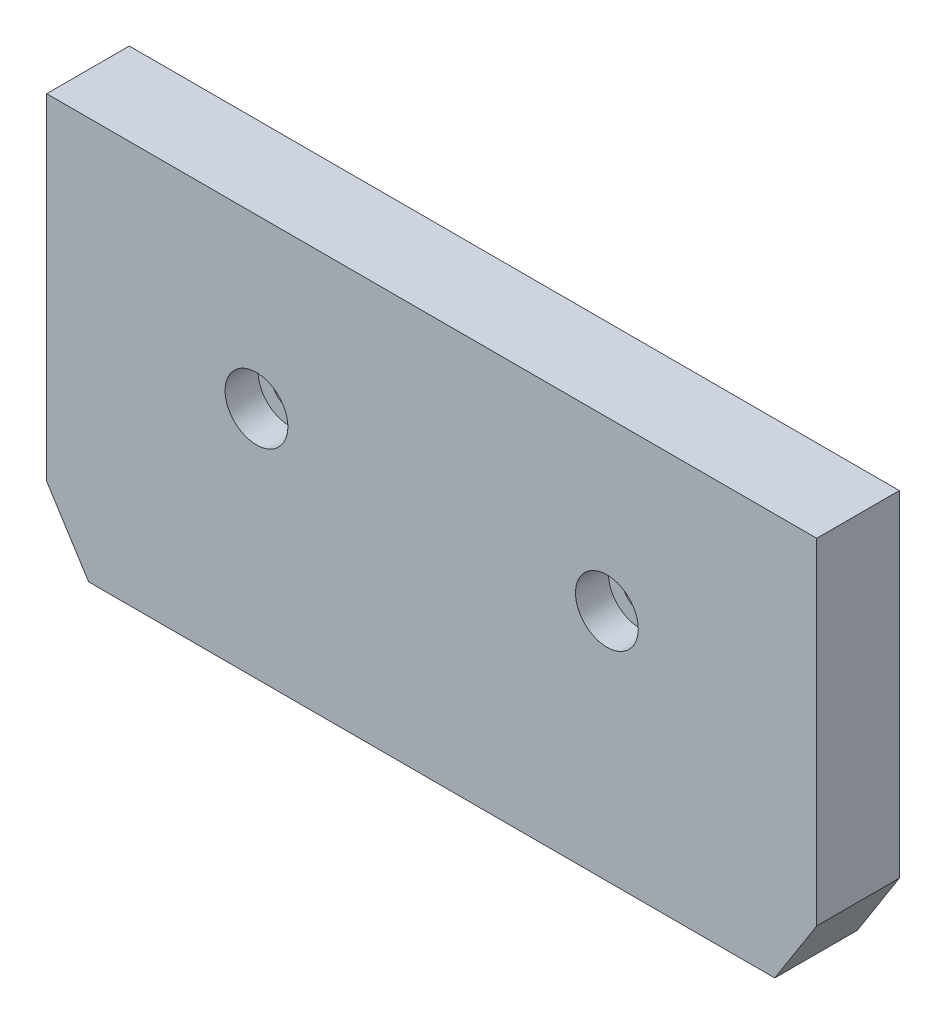
ISO-10303-21;
HEADER;
FILE_DESCRIPTION(('STEP AP214'),'2;1');
FILE_NAME('part.step','',(''),(''),'','','');
FILE_SCHEMA(('AUTOMOTIVE_DESIGN { 1 0 10303 214 1 1 1 1 }'));
ENDSEC;
DATA;
#1=APPLICATION_CONTEXT('core data for automotive mechanical design processes');
#2=APPLICATION_PROTOCOL_DEFINITION('international standard','automotive_design',2000,#1);
#3=PRODUCT_CONTEXT('',#1,'mechanical');
#4=PRODUCT('Part','Part','',(#3));
#5=PRODUCT_RELATED_PRODUCT_CATEGORY('part','',(#4));
#6=PRODUCT_DEFINITION_FORMATION('','',#4);
#7=PRODUCT_DEFINITION_CONTEXT('part definition',#1,'design');
#8=PRODUCT_DEFINITION('design','',#6,#7);
#9=PRODUCT_DEFINITION_SHAPE('','',#8);
#10=(LENGTH_UNIT() NAMED_UNIT(*) SI_UNIT(.MILLI.,.METRE.));
#11=(NAMED_UNIT(*) PLANE_ANGLE_UNIT() SI_UNIT($,.RADIAN.));
#12=(NAMED_UNIT(*) SI_UNIT($,.STERADIAN.) SOLID_ANGLE_UNIT());
#13=UNCERTAINTY_MEASURE_WITH_UNIT(LENGTH_MEASURE(1.E-05),#10,'distance_accuracy_value','');
#14=(GEOMETRIC_REPRESENTATION_CONTEXT(3) GLOBAL_UNCERTAINTY_ASSIGNED_CONTEXT((#13)) GLOBAL_UNIT_ASSIGNED_CONTEXT((#10,
#11,#12)) REPRESENTATION_CONTEXT('',''));
#15=CARTESIAN_POINT('',(0.,0.,0.));
#16=DIRECTION('',(0.,0.,1.));
#17=DIRECTION('',(1.,0.,0.));
#18=AXIS2_PLACEMENT_3D('',#15,#16,#17);
#19=CARTESIAN_POINT('',(139.162889518911,-88.3684348445086,10.));
#20=DIRECTION('',(0.844182496695168,-0.536055885401432,0.));
#21=DIRECTION('',(0.536055885401432,0.844182496695168,0.));
#22=AXIS2_PLACEMENT_3D('',#19,#20,#21);
#23=PLANE('',#22);
#24=DIRECTION('',(-0.536055885401432,-0.844182496695168,0.));
#25=VECTOR('',#24,1.);
#26=CARTESIAN_POINT('',(139.162889518911,-88.3684348445086,0.));
#27=LINE('',#26,#25);
#28=CARTESIAN_POINT('',(186.44,-13.9162923546049,0.));
#29=VERTEX_POINT('',#28);
#30=CARTESIAN_POINT('',(181.36,-21.9162923546049,0.));
#31=VERTEX_POINT('',#30);
#32=EDGE_CURVE('E134',#29,#31,#27,.T.);
#33=ORIENTED_EDGE('',*,*,#32,.F.);
#34=DIRECTION('',(0.,0.,-1.));
#35=VECTOR('',#34,1.);
#36=CARTESIAN_POINT('',(186.44,-13.9162923546049,10.));
#37=LINE('',#36,#35);
#38=CARTESIAN_POINT('',(186.44,-13.9162923546049,10.));
#39=VERTEX_POINT('',#38);
#40=EDGE_CURVE('E11',#39,#29,#37,.T.);
#41=ORIENTED_EDGE('',*,*,#40,.F.);
#42=DIRECTION('',(-0.536055885401432,-0.844182496695168,0.));
#43=VECTOR('',#42,1.);
#44=CARTESIAN_POINT('',(139.162889518911,-88.3684348445086,10.));
#45=LINE('',#44,#43);
#46=CARTESIAN_POINT('',(181.36,-21.9162923546049,10.));
#47=VERTEX_POINT('',#46);
#48=EDGE_CURVE('E154',#39,#47,#45,.T.);
#49=ORIENTED_EDGE('',*,*,#48,.T.);
#50=DIRECTION('',(0.,0.,-1.));
#51=VECTOR('',#50,1.);
#52=CARTESIAN_POINT('',(181.36,-21.9162923546049,10.));
#53=LINE('',#52,#51);
#54=EDGE_CURVE('E95',#47,#31,#53,.T.);
#55=ORIENTED_EDGE('',*,*,#54,.T.);
#56=EDGE_LOOP('',(#33,#41,#49,#55));
#57=FACE_BOUND('',#56,.T.);
#58=ADVANCED_FACE('F47',(#57),#23,.T.);
#59=CARTESIAN_POINT('',(186.44,0.,10.));
#60=DIRECTION('',(1.,0.,0.));
#61=DIRECTION('',(0.,0.,-1.));
#62=AXIS2_PLACEMENT_3D('',#59,#60,#61);
#63=PLANE('',#62);
#64=DIRECTION('',(0.,-1.,0.));
#65=VECTOR('',#64,1.);
#66=CARTESIAN_POINT('',(186.44,0.,0.));
#67=LINE('',#66,#65);
#68=CARTESIAN_POINT('',(186.44,26.7237076453951,0.));
#69=VERTEX_POINT('',#68);
#70=EDGE_CURVE('E138',#69,#29,#67,.T.);
#71=ORIENTED_EDGE('',*,*,#70,.F.);
#72=DIRECTION('',(0.,0.,-1.));
#73=VECTOR('',#72,1.);
#74=CARTESIAN_POINT('',(186.44,26.7237076453951,10.));
#75=LINE('',#74,#73);
#76=CARTESIAN_POINT('',(186.44,26.7237076453951,10.));
#77=VERTEX_POINT('',#76);
#78=EDGE_CURVE('E57',#77,#69,#75,.T.);
#79=ORIENTED_EDGE('',*,*,#78,.F.);
#80=DIRECTION('',(0.,-1.,0.));
#81=VECTOR('',#80,1.);
#82=CARTESIAN_POINT('',(186.44,0.,10.));
#83=LINE('',#82,#81);
#84=EDGE_CURVE('E195',#77,#39,#83,.T.);
#85=ORIENTED_EDGE('',*,*,#84,.T.);
#86=ORIENTED_EDGE('',*,*,#40,.T.);
#87=EDGE_LOOP('',(#71,#79,#85,#86));
#88=FACE_BOUND('',#87,.T.);
#89=ADVANCED_FACE('F209',(#88),#63,.T.);
#90=CARTESIAN_POINT('',(0.,26.7237076453951,10.));
#91=DIRECTION('',(0.,1.,0.));
#92=DIRECTION('',(0.,0.,1.));
#93=AXIS2_PLACEMENT_3D('',#90,#91,#92);
#94=PLANE('',#93);
#95=DIRECTION('',(1.,0.,0.));
#96=VECTOR('',#95,1.);
#97=CARTESIAN_POINT('',(0.,26.7237076453951,0.));
#98=LINE('',#97,#96);
#99=CARTESIAN_POINT('',(93.22,26.7237076453951,0.));
#100=VERTEX_POINT('',#99);
#101=EDGE_CURVE('E143',#100,#69,#98,.T.);
#102=ORIENTED_EDGE('',*,*,#101,.F.);
#103=DIRECTION('',(0.,0.,-1.));
#104=VECTOR('',#103,1.);
#105=CARTESIAN_POINT('',(93.22,26.7237076453951,10.));
#106=LINE('',#105,#104);
#107=CARTESIAN_POINT('',(93.22,26.7237076453951,10.));
#108=VERTEX_POINT('',#107);
#109=EDGE_CURVE('E124',#108,#100,#106,.T.);
#110=ORIENTED_EDGE('',*,*,#109,.F.);
#111=DIRECTION('',(1.,0.,0.));
#112=VECTOR('',#111,1.);
#113=CARTESIAN_POINT('',(0.,26.7237076453951,10.));
#114=LINE('',#113,#112);
#115=EDGE_CURVE('E115',#108,#77,#114,.T.);
#116=ORIENTED_EDGE('',*,*,#115,.T.);
#117=ORIENTED_EDGE('',*,*,#78,.T.);
#118=EDGE_LOOP('',(#102,#110,#116,#117));
#119=FACE_BOUND('',#118,.T.);
#120=ADVANCED_FACE('F201',(#119),#94,.T.);
#121=CARTESIAN_POINT('',(93.22,0.,10.));
#122=DIRECTION('',(1.,0.,0.));
#123=DIRECTION('',(0.,0.,-1.));
#124=AXIS2_PLACEMENT_3D('',#121,#122,#123);
#125=PLANE('',#124);
#126=DIRECTION('',(0.,-1.,0.));
#127=VECTOR('',#126,1.);
#128=CARTESIAN_POINT('',(93.22,0.,0.));
#129=LINE('',#128,#127);
#130=CARTESIAN_POINT('',(93.22,-13.9162923546049,0.));
#131=VERTEX_POINT('',#130);
#132=EDGE_CURVE('E122',#100,#131,#129,.T.);
#133=ORIENTED_EDGE('',*,*,#132,.T.);
#134=DIRECTION('',(0.,0.,-1.));
#135=VECTOR('',#134,1.);
#136=CARTESIAN_POINT('',(93.22,-13.9162923546049,10.));
#137=LINE('',#136,#135);
#138=CARTESIAN_POINT('',(93.22,-13.9162923546049,10.));
#139=VERTEX_POINT('',#138);
#140=EDGE_CURVE('E119',#139,#131,#137,.T.);
#141=ORIENTED_EDGE('',*,*,#140,.F.);
#142=DIRECTION('',(0.,-1.,0.));
#143=VECTOR('',#142,1.);
#144=CARTESIAN_POINT('',(93.22,0.,10.));
#145=LINE('',#144,#143);
#146=EDGE_CURVE('E108',#108,#139,#145,.T.);
#147=ORIENTED_EDGE('',*,*,#146,.F.);
#148=ORIENTED_EDGE('',*,*,#109,.T.);
#149=EDGE_LOOP('',(#133,#141,#147,#148));
#150=FACE_BOUND('',#149,.T.);
#151=ADVANCED_FACE('F120',(#150),#125,.F.);
#152=CARTESIAN_POINT('',(60.1351560546782,38.1858240947207,10.));
#153=DIRECTION('',(0.844182496695168,0.536055885401432,0.));
#154=DIRECTION('',(-0.536055885401432,0.844182496695168,0.));
#155=AXIS2_PLACEMENT_3D('',#152,#153,#154);
#156=PLANE('',#155);
#157=DIRECTION('',(0.536055885401432,-0.844182496695168,0.));
#158=VECTOR('',#157,1.);
#159=CARTESIAN_POINT('',(60.1351560546782,38.1858240947207,0.));
#160=LINE('',#159,#158);
#161=CARTESIAN_POINT('',(98.3,-21.9162923546049,0.));
#162=VERTEX_POINT('',#161);
#163=EDGE_CURVE('E88',#131,#162,#160,.T.);
#164=ORIENTED_EDGE('',*,*,#163,.T.);
#165=DIRECTION('',(0.,0.,-1.));
#166=VECTOR('',#165,1.);
#167=CARTESIAN_POINT('',(98.3,-21.9162923546049,10.));
#168=LINE('',#167,#166);
#169=CARTESIAN_POINT('',(98.3,-21.9162923546049,10.));
#170=VERTEX_POINT('',#169);
#171=EDGE_CURVE('E125',#170,#162,#168,.T.);
#172=ORIENTED_EDGE('',*,*,#171,.F.);
#173=DIRECTION('',(0.536055885401432,-0.844182496695168,0.));
#174=VECTOR('',#173,1.);
#175=CARTESIAN_POINT('',(60.1351560546782,38.1858240947207,10.));
#176=LINE('',#175,#174);
#177=EDGE_CURVE('E112',#139,#170,#176,.T.);
#178=ORIENTED_EDGE('',*,*,#177,.F.);
#179=ORIENTED_EDGE('',*,*,#140,.T.);
#180=EDGE_LOOP('',(#164,#172,#178,#179));
#181=FACE_BOUND('',#180,.T.);
#182=ADVANCED_FACE('F127',(#181),#156,.F.);
#183=CARTESIAN_POINT('',(0.,-21.9162923546049,10.));
#184=DIRECTION('',(0.,1.,0.));
#185=DIRECTION('',(0.,0.,1.));
#186=AXIS2_PLACEMENT_3D('',#183,#184,#185);
#187=PLANE('',#186);
#188=DIRECTION('',(1.,0.,0.));
#189=VECTOR('',#188,1.);
#190=CARTESIAN_POINT('',(0.,-21.9162923546049,0.));
#191=LINE('',#190,#189);
#192=EDGE_CURVE('E151',#162,#31,#191,.T.);
#193=ORIENTED_EDGE('',*,*,#192,.T.);
#194=ORIENTED_EDGE('',*,*,#54,.F.);
#195=DIRECTION('',(1.,0.,0.));
#196=VECTOR('',#195,1.);
#197=CARTESIAN_POINT('',(0.,-21.9162923546049,10.));
#198=LINE('',#197,#196);
#199=EDGE_CURVE('E66',#170,#47,#198,.T.);
#200=ORIENTED_EDGE('',*,*,#199,.F.);
#201=ORIENTED_EDGE('',*,*,#171,.T.);
#202=EDGE_LOOP('',(#193,#194,#200,#201));
#203=FACE_BOUND('',#202,.T.);
#204=ADVANCED_FACE('F207',(#203),#187,.F.);
#205=CARTESIAN_POINT('',(0.,0.,10.));
#206=DIRECTION('',(0.,0.,1.));
#207=DIRECTION('',(1.,0.,0.));
#208=AXIS2_PLACEMENT_3D('',#205,#206,#207);
#209=PLANE('',#208);
#210=CARTESIAN_POINT('',(161.04,6.4037076453951,10.));
#211=DIRECTION('',(0.,0.,1.));
#212=DIRECTION('',(1.,0.,0.));
#213=AXIS2_PLACEMENT_3D('',#210,#211,#212);
#214=CIRCLE('',#213,3.8);
#215=CARTESIAN_POINT('',(164.84,6.4037076453951,10.));
#216=VERTEX_POINT('',#215);
#217=EDGE_CURVE('E186',#216,#216,#214,.T.);
#218=ORIENTED_EDGE('',*,*,#217,.F.);
#219=EDGE_LOOP('',(#218));
#220=FACE_BOUND('',#219,.T.);
#221=CARTESIAN_POINT('',(118.62,6.4037076453951,10.));
#222=DIRECTION('',(0.,0.,1.));
#223=DIRECTION('',(1.,0.,0.));
#224=AXIS2_PLACEMENT_3D('',#221,#222,#223);
#225=CIRCLE('',#224,3.8);
#226=CARTESIAN_POINT('',(122.42,6.4037076453951,10.));
#227=VERTEX_POINT('',#226);
#228=EDGE_CURVE('E172',#227,#227,#225,.T.);
#229=ORIENTED_EDGE('',*,*,#228,.F.);
#230=EDGE_LOOP('',(#229));
#231=FACE_BOUND('',#230,.T.);
#232=ORIENTED_EDGE('',*,*,#48,.F.);
#233=ORIENTED_EDGE('',*,*,#84,.F.);
#234=ORIENTED_EDGE('',*,*,#115,.F.);
#235=ORIENTED_EDGE('',*,*,#146,.T.);
#236=ORIENTED_EDGE('',*,*,#177,.T.);
#237=ORIENTED_EDGE('',*,*,#199,.T.);
#238=EDGE_LOOP('',(#232,#233,#234,#235,#236,#237));
#239=FACE_BOUND('',#238,.T.);
#240=ADVANCED_FACE('F110',(#220,#231,#239),#209,.T.);
#241=CARTESIAN_POINT('',(0.,0.,0.));
#242=DIRECTION('',(0.,0.,1.));
#243=DIRECTION('',(1.,0.,0.));
#244=AXIS2_PLACEMENT_3D('',#241,#242,#243);
#245=PLANE('',#244);
#246=CARTESIAN_POINT('',(161.04,6.4037076453951,0.));
#247=DIRECTION('',(0.,0.,1.));
#248=DIRECTION('',(1.,0.,0.));
#249=AXIS2_PLACEMENT_3D('',#246,#247,#248);
#250=CIRCLE('',#249,2.04999999999999);
#251=CARTESIAN_POINT('',(163.09,6.4037076453951,0.));
#252=VERTEX_POINT('',#251);
#253=EDGE_CURVE('E50',#252,#252,#250,.T.);
#254=ORIENTED_EDGE('',*,*,#253,.T.);
#255=EDGE_LOOP('',(#254));
#256=FACE_BOUND('',#255,.T.);
#257=CARTESIAN_POINT('',(118.62,6.4037076453951,0.));
#258=DIRECTION('',(0.,0.,1.));
#259=DIRECTION('',(1.,0.,0.));
#260=AXIS2_PLACEMENT_3D('',#257,#258,#259);
#261=CIRCLE('',#260,2.04999999999999);
#262=CARTESIAN_POINT('',(120.67,6.4037076453951,0.));
#263=VERTEX_POINT('',#262);
#264=EDGE_CURVE('E162',#263,#263,#261,.T.);
#265=ORIENTED_EDGE('',*,*,#264,.T.);
#266=EDGE_LOOP('',(#265));
#267=FACE_BOUND('',#266,.T.);
#268=ORIENTED_EDGE('',*,*,#32,.T.);
#269=ORIENTED_EDGE('',*,*,#192,.F.);
#270=ORIENTED_EDGE('',*,*,#163,.F.);
#271=ORIENTED_EDGE('',*,*,#132,.F.);
#272=ORIENTED_EDGE('',*,*,#101,.T.);
#273=ORIENTED_EDGE('',*,*,#70,.T.);
#274=EDGE_LOOP('',(#268,#269,#270,#271,#272,#273));
#275=FACE_BOUND('',#274,.T.);
#276=ADVANCED_FACE('F204',(#256,#267,#275),#245,.F.);
#277=CARTESIAN_POINT('',(118.62,6.4037076453951,6.0122));
#278=DIRECTION('',(0.,0.,1.));
#279=DIRECTION('',(1.,0.,0.));
#280=AXIS2_PLACEMENT_3D('',#277,#278,#279);
#281=CYLINDRICAL_SURFACE('',#280,3.8);
#282=CARTESIAN_POINT('',(118.62,6.4037076453951,6.0122));
#283=DIRECTION('',(0.,0.,1.));
#284=DIRECTION('',(1.,0.,0.));
#285=AXIS2_PLACEMENT_3D('',#282,#283,#284);
#286=CIRCLE('',#285,3.8);
#287=CARTESIAN_POINT('',(122.42,6.4037076453951,6.0122));
#288=VERTEX_POINT('',#287);
#289=EDGE_CURVE('E165',#288,#288,#286,.T.);
#290=ORIENTED_EDGE('',*,*,#289,.F.);
#291=EDGE_LOOP('',(#290));
#292=FACE_BOUND('',#291,.T.);
#293=ORIENTED_EDGE('',*,*,#228,.T.);
#294=EDGE_LOOP('',(#293));
#295=FACE_BOUND('',#294,.T.);
#296=ADVANCED_FACE('F225',(#292,#295),#281,.F.);
#297=CARTESIAN_POINT('',(118.62,6.4037076453951,6.0122));
#298=DIRECTION('',(0.,0.,1.));
#299=DIRECTION('',(1.,0.,0.));
#300=AXIS2_PLACEMENT_3D('',#297,#298,#299);
#301=PLANE('',#300);
#302=CARTESIAN_POINT('',(118.62,6.4037076453951,6.0122));
#303=DIRECTION('',(0.,0.,1.));
#304=DIRECTION('',(1.,0.,0.));
#305=AXIS2_PLACEMENT_3D('',#302,#303,#304);
#306=CIRCLE('',#305,2.04999999999999);
#307=CARTESIAN_POINT('',(120.67,6.4037076453951,6.0122));
#308=VERTEX_POINT('',#307);
#309=EDGE_CURVE('E166',#308,#308,#306,.T.);
#310=ORIENTED_EDGE('',*,*,#309,.F.);
#311=EDGE_LOOP('',(#310));
#312=FACE_BOUND('',#311,.T.);
#313=ORIENTED_EDGE('',*,*,#289,.T.);
#314=EDGE_LOOP('',(#313));
#315=FACE_BOUND('',#314,.T.);
#316=ADVANCED_FACE('F230',(#312,#315),#301,.T.);
#317=CARTESIAN_POINT('',(161.04,6.4037076453951,6.0122));
#318=DIRECTION('',(0.,0.,1.));
#319=DIRECTION('',(1.,0.,0.));
#320=AXIS2_PLACEMENT_3D('',#317,#318,#319);
#321=CYLINDRICAL_SURFACE('',#320,3.8);
#322=CARTESIAN_POINT('',(161.04,6.4037076453951,6.0122));
#323=DIRECTION('',(0.,0.,1.));
#324=DIRECTION('',(1.,0.,0.));
#325=AXIS2_PLACEMENT_3D('',#322,#323,#324);
#326=CIRCLE('',#325,3.8);
#327=CARTESIAN_POINT('',(164.84,6.4037076453951,6.0122));
#328=VERTEX_POINT('',#327);
#329=EDGE_CURVE('E139',#328,#328,#326,.T.);
#330=ORIENTED_EDGE('',*,*,#329,.F.);
#331=EDGE_LOOP('',(#330));
#332=FACE_BOUND('',#331,.T.);
#333=ORIENTED_EDGE('',*,*,#217,.T.);
#334=EDGE_LOOP('',(#333));
#335=FACE_BOUND('',#334,.T.);
#336=ADVANCED_FACE('F233',(#332,#335),#321,.F.);
#337=CARTESIAN_POINT('',(161.04,6.4037076453951,6.0122));
#338=DIRECTION('',(0.,0.,1.));
#339=DIRECTION('',(1.,0.,0.));
#340=AXIS2_PLACEMENT_3D('',#337,#338,#339);
#341=PLANE('',#340);
#342=CARTESIAN_POINT('',(161.04,6.4037076453951,6.0122));
#343=DIRECTION('',(0.,0.,1.));
#344=DIRECTION('',(1.,0.,0.));
#345=AXIS2_PLACEMENT_3D('',#342,#343,#344);
#346=CIRCLE('',#345,2.04999999999999);
#347=CARTESIAN_POINT('',(163.09,6.4037076453951,6.0122));
#348=VERTEX_POINT('',#347);
#349=EDGE_CURVE('E180',#348,#348,#346,.T.);
#350=ORIENTED_EDGE('',*,*,#349,.F.);
#351=EDGE_LOOP('',(#350));
#352=FACE_BOUND('',#351,.T.);
#353=ORIENTED_EDGE('',*,*,#329,.T.);
#354=EDGE_LOOP('',(#353));
#355=FACE_BOUND('',#354,.T.);
#356=ADVANCED_FACE('F240',(#352,#355),#341,.T.);
#357=CARTESIAN_POINT('',(118.62,6.4037076453951,-1.7856));
#358=DIRECTION('',(0.,0.,1.));
#359=DIRECTION('',(1.,0.,0.));
#360=AXIS2_PLACEMENT_3D('',#357,#358,#359);
#361=CYLINDRICAL_SURFACE('',#360,2.04999999999999);
#362=ORIENTED_EDGE('',*,*,#309,.T.);
#363=EDGE_LOOP('',(#362));
#364=FACE_BOUND('',#363,.T.);
#365=ORIENTED_EDGE('',*,*,#264,.F.);
#366=EDGE_LOOP('',(#365));
#367=FACE_BOUND('',#366,.T.);
#368=ADVANCED_FACE('F244',(#364,#367),#361,.F.);
#369=CARTESIAN_POINT('',(161.04,6.4037076453951,-1.7856));
#370=DIRECTION('',(0.,0.,1.));
#371=DIRECTION('',(1.,0.,0.));
#372=AXIS2_PLACEMENT_3D('',#369,#370,#371);
#373=CYLINDRICAL_SURFACE('',#372,2.04999999999999);
#374=ORIENTED_EDGE('',*,*,#349,.T.);
#375=EDGE_LOOP('',(#374));
#376=FACE_BOUND('',#375,.T.);
#377=ORIENTED_EDGE('',*,*,#253,.F.);
#378=EDGE_LOOP('',(#377));
#379=FACE_BOUND('',#378,.T.);
#380=ADVANCED_FACE('F248',(#376,#379),#373,.F.);
#381=CLOSED_SHELL('',(#58,#89,#120,#151,#182,#204,#240,#276,#296,#316,#336,#356,#368,#380));
#382=MANIFOLD_SOLID_BREP('B2',#381);
#383=ADVANCED_BREP_SHAPE_REPRESENTATION('',(#18,#382),#14);
#384=SHAPE_DEFINITION_REPRESENTATION(#9,#383);
ENDSEC;
END-ISO-10303-21;
